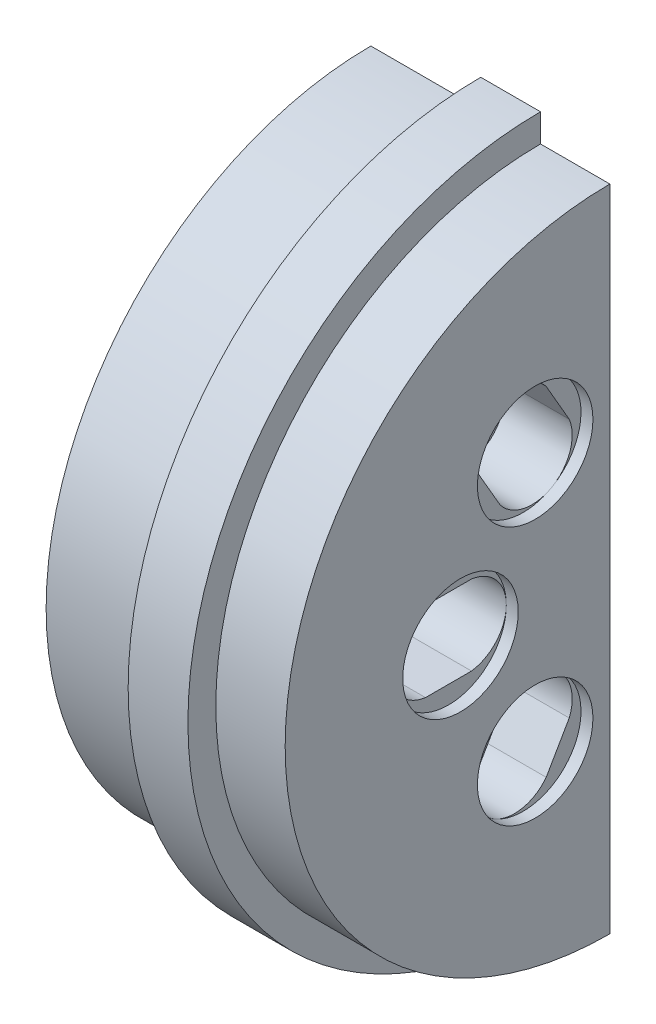
ISO-10303-21;
HEADER;
FILE_DESCRIPTION(('STEP AP214'),'2;1');
FILE_NAME('part.step','',(''),(''),'','','');
FILE_SCHEMA(('AUTOMOTIVE_DESIGN { 1 0 10303 214 1 1 1 1 }'));
ENDSEC;
DATA;
#1=APPLICATION_CONTEXT('core data for automotive mechanical design processes');
#2=APPLICATION_PROTOCOL_DEFINITION('international standard','automotive_design',2000,#1);
#3=PRODUCT_CONTEXT('',#1,'mechanical');
#4=PRODUCT('Part','Part','',(#3));
#5=PRODUCT_RELATED_PRODUCT_CATEGORY('part','',(#4));
#6=PRODUCT_DEFINITION_FORMATION('','',#4);
#7=PRODUCT_DEFINITION_CONTEXT('part definition',#1,'design');
#8=PRODUCT_DEFINITION('design','',#6,#7);
#9=PRODUCT_DEFINITION_SHAPE('','',#8);
#10=(LENGTH_UNIT() NAMED_UNIT(*) SI_UNIT(.MILLI.,.METRE.));
#11=(NAMED_UNIT(*) PLANE_ANGLE_UNIT() SI_UNIT($,.RADIAN.));
#12=(NAMED_UNIT(*) SI_UNIT($,.STERADIAN.) SOLID_ANGLE_UNIT());
#13=UNCERTAINTY_MEASURE_WITH_UNIT(LENGTH_MEASURE(1.E-05),#10,'distance_accuracy_value','');
#14=(GEOMETRIC_REPRESENTATION_CONTEXT(3) GLOBAL_UNCERTAINTY_ASSIGNED_CONTEXT((#13)) GLOBAL_UNIT_ASSIGNED_CONTEXT((#10,
#11,#12)) REPRESENTATION_CONTEXT('',''));
#15=CARTESIAN_POINT('',(0.,0.,0.));
#16=DIRECTION('',(0.,0.,1.));
#17=DIRECTION('',(1.,0.,0.));
#18=AXIS2_PLACEMENT_3D('',#15,#16,#17);
#19=CARTESIAN_POINT('',(10.,-2.93192297526447E-12,33.0929244030549));
#20=DIRECTION('',(1.,0.,0.));
#21=DIRECTION('',(0.,0.,-1.));
#22=AXIS2_PLACEMENT_3D('',#19,#20,#21);
#23=CYLINDRICAL_SURFACE('',#22,10.0929244030569);
#24=CARTESIAN_POINT('',(27.,-2.93192297526447E-12,33.0929244030549));
#25=DIRECTION('',(1.,0.,0.));
#26=DIRECTION('',(0.,0.,-1.));
#27=AXIS2_PLACEMENT_3D('',#24,#25,#26);
#28=CIRCLE('',#27,10.0929244030569);
#29=CARTESIAN_POINT('',(27.,-9.64650644313974E-12,23.));
#30=VERTEX_POINT('',#29);
#31=CARTESIAN_POINT('',(27.,-10.0000000000029,31.7264973081018));
#32=VERTEX_POINT('',#31);
#33=EDGE_CURVE('E251',#30,#32,#28,.F.);
#34=ORIENTED_EDGE('',*,*,#33,.F.);
#35=CARTESIAN_POINT('',(27.,9.99999999999707,31.7264973081017));
#36=VERTEX_POINT('',#35);
#37=EDGE_CURVE('E247',#36,#30,#28,.F.);
#38=ORIENTED_EDGE('',*,*,#37,.F.);
#39=DIRECTION('',(1.,0.,0.));
#40=VECTOR('',#39,1.);
#41=CARTESIAN_POINT('',(10.,9.99999999999707,31.7264973081017));
#42=LINE('',#41,#40);
#43=CARTESIAN_POINT('',(10.,9.99999999999707,31.7264973081017));
#44=VERTEX_POINT('',#43);
#45=EDGE_CURVE('E256',#44,#36,#42,.T.);
#46=ORIENTED_EDGE('',*,*,#45,.F.);
#47=CARTESIAN_POINT('',(10.,-2.93192297526447E-12,33.0929244030549));
#48=DIRECTION('',(1.,0.,0.));
#49=DIRECTION('',(0.,0.,1.));
#50=AXIS2_PLACEMENT_3D('',#47,#48,#49);
#51=CIRCLE('',#50,10.0929244030569);
#52=CARTESIAN_POINT('',(10.,-10.0000000000029,31.7264973081018));
#53=VERTEX_POINT('',#52);
#54=EDGE_CURVE('E283',#53,#44,#51,.T.);
#55=ORIENTED_EDGE('',*,*,#54,.F.);
#56=DIRECTION('',(1.,0.,0.));
#57=VECTOR('',#56,1.);
#58=CARTESIAN_POINT('',(10.,-10.0000000000029,31.7264973081018));
#59=LINE('',#58,#57);
#60=EDGE_CURVE('E255',#53,#32,#59,.T.);
#61=ORIENTED_EDGE('',*,*,#60,.T.);
#62=EDGE_LOOP('',(#34,#38,#46,#55,#61));
#63=FACE_BOUND('',#62,.T.);
#64=ADVANCED_FACE('F45',(#63),#23,.F.);
#65=CARTESIAN_POINT('',(10.,-10.0000000000029,43.2735026918943));
#66=DIRECTION('',(0.,-1.,0.));
#67=DIRECTION('',(0.,0.,-1.));
#68=AXIS2_PLACEMENT_3D('',#65,#66,#67);
#69=PLANE('',#68);
#70=DIRECTION('',(0.,0.,1.));
#71=VECTOR('',#70,1.);
#72=CARTESIAN_POINT('',(27.,-10.0000000000029,43.2735026918943));
#73=LINE('',#72,#71);
#74=CARTESIAN_POINT('',(27.,-10.0000000000029,43.2735026918943));
#75=VERTEX_POINT('',#74);
#76=EDGE_CURVE('E252',#32,#75,#73,.T.);
#77=ORIENTED_EDGE('',*,*,#76,.F.);
#78=ORIENTED_EDGE('',*,*,#60,.F.);
#79=DIRECTION('',(0.,0.,-1.));
#80=VECTOR('',#79,1.);
#81=CARTESIAN_POINT('',(10.,-10.0000000000029,43.2735026918943));
#82=LINE('',#81,#80);
#83=CARTESIAN_POINT('',(10.,-10.0000000000029,43.2735026918943));
#84=VERTEX_POINT('',#83);
#85=EDGE_CURVE('E260',#84,#53,#82,.T.);
#86=ORIENTED_EDGE('',*,*,#85,.F.);
#87=DIRECTION('',(1.,0.,0.));
#88=VECTOR('',#87,1.);
#89=CARTESIAN_POINT('',(10.,-10.0000000000029,43.2735026918943));
#90=LINE('',#89,#88);
#91=EDGE_CURVE('E265',#84,#75,#90,.T.);
#92=ORIENTED_EDGE('',*,*,#91,.T.);
#93=EDGE_LOOP('',(#77,#78,#86,#92));
#94=FACE_BOUND('',#93,.T.);
#95=ADVANCED_FACE('F503',(#94),#69,.F.);
#96=CARTESIAN_POINT('',(10.,-2.91348334438119E-12,41.907075596941));
#97=DIRECTION('',(1.,0.,0.));
#98=DIRECTION('',(0.,0.,-1.));
#99=AXIS2_PLACEMENT_3D('',#96,#97,#98);
#100=CYLINDRICAL_SURFACE('',#99,10.0929244030569);
#101=CARTESIAN_POINT('',(27.,-2.91348334438119E-12,41.907075596941));
#102=DIRECTION('',(1.,0.,0.));
#103=DIRECTION('',(0.,0.,-1.));
#104=AXIS2_PLACEMENT_3D('',#101,#102,#103);
#105=CIRCLE('',#104,10.0929244030569);
#106=CARTESIAN_POINT('',(27.,-9.58583703961193E-12,52.));
#107=VERTEX_POINT('',#106);
#108=CARTESIAN_POINT('',(27.,9.99999999999709,43.2735026918942));
#109=VERTEX_POINT('',#108);
#110=EDGE_CURVE('E60',#107,#109,#105,.F.);
#111=ORIENTED_EDGE('',*,*,#110,.F.);
#112=EDGE_CURVE('E248',#75,#107,#105,.F.);
#113=ORIENTED_EDGE('',*,*,#112,.F.);
#114=ORIENTED_EDGE('',*,*,#91,.F.);
#115=CARTESIAN_POINT('',(10.,-2.91348334438119E-12,41.907075596941));
#116=DIRECTION('',(1.,0.,0.));
#117=DIRECTION('',(0.,0.,1.));
#118=AXIS2_PLACEMENT_3D('',#115,#116,#117);
#119=CIRCLE('',#118,10.0929244030569);
#120=CARTESIAN_POINT('',(10.,9.99999999999709,43.2735026918942));
#121=VERTEX_POINT('',#120);
#122=EDGE_CURVE('E275',#121,#84,#119,.T.);
#123=ORIENTED_EDGE('',*,*,#122,.F.);
#124=DIRECTION('',(1.,0.,0.));
#125=VECTOR('',#124,1.);
#126=CARTESIAN_POINT('',(10.,9.99999999999709,43.2735026918942));
#127=LINE('',#126,#125);
#128=EDGE_CURVE('E261',#121,#109,#127,.T.);
#129=ORIENTED_EDGE('',*,*,#128,.T.);
#130=EDGE_LOOP('',(#111,#113,#114,#123,#129));
#131=FACE_BOUND('',#130,.T.);
#132=ADVANCED_FACE('F510',(#131),#100,.F.);
#133=CARTESIAN_POINT('',(10.,9.99999999999707,31.7264973081017));
#134=DIRECTION('',(0.,1.,0.));
#135=DIRECTION('',(0.,0.,1.));
#136=AXIS2_PLACEMENT_3D('',#133,#134,#135);
#137=PLANE('',#136);
#138=DIRECTION('',(0.,0.,-1.));
#139=VECTOR('',#138,1.);
#140=CARTESIAN_POINT('',(27.,9.99999999999707,31.7264973081017));
#141=LINE('',#140,#139);
#142=EDGE_CURVE('E11',#109,#36,#141,.T.);
#143=ORIENTED_EDGE('',*,*,#142,.F.);
#144=ORIENTED_EDGE('',*,*,#128,.F.);
#145=DIRECTION('',(0.,0.,1.));
#146=VECTOR('',#145,1.);
#147=CARTESIAN_POINT('',(10.,9.99999999999707,31.7264973081017));
#148=LINE('',#147,#146);
#149=EDGE_CURVE('E279',#44,#121,#148,.T.);
#150=ORIENTED_EDGE('',*,*,#149,.F.);
#151=ORIENTED_EDGE('',*,*,#45,.T.);
#152=EDGE_LOOP('',(#143,#144,#150,#151));
#153=FACE_BOUND('',#152,.T.);
#154=ADVANCED_FACE('F518',(#153),#137,.F.);
#155=CARTESIAN_POINT('',(10.,-28.659313218568,16.5464622015229));
#156=DIRECTION('',(1.,0.,0.));
#157=DIRECTION('',(0.,0.,-1.));
#158=AXIS2_PLACEMENT_3D('',#155,#156,#157);
#159=CYLINDRICAL_SURFACE('',#158,10.0929244030569);
#160=CARTESIAN_POINT('',(27.,-28.659313218568,16.5464622015229));
#161=DIRECTION('',(1.,0.,0.));
#162=DIRECTION('',(0.,0.,-1.));
#163=AXIS2_PLACEMENT_3D('',#160,#161,#162);
#164=CIRCLE('',#163,10.0929244030569);
#165=CARTESIAN_POINT('',(27.,-19.9185842870527,11.4999999999816));
#166=VERTEX_POINT('',#165);
#167=CARTESIAN_POINT('',(27.,-32.4759526419192,7.20299461620192));
#168=VERTEX_POINT('',#167);
#169=EDGE_CURVE('E241',#166,#168,#164,.F.);
#170=ORIENTED_EDGE('',*,*,#169,.F.);
#171=CARTESIAN_POINT('',(27.,-22.4759526419191,24.5235026918907));
#172=VERTEX_POINT('',#171);
#173=EDGE_CURVE('E237',#172,#166,#164,.F.);
#174=ORIENTED_EDGE('',*,*,#173,.F.);
#175=DIRECTION('',(1.,0.,0.));
#176=VECTOR('',#175,1.);
#177=CARTESIAN_POINT('',(10.,-22.4759526419191,24.5235026918907));
#178=LINE('',#177,#176);
#179=CARTESIAN_POINT('',(10.,-22.4759526419191,24.5235026918907));
#180=VERTEX_POINT('',#179);
#181=EDGE_CURVE('E319',#180,#172,#178,.T.);
#182=ORIENTED_EDGE('',*,*,#181,.F.);
#183=CARTESIAN_POINT('',(10.,-28.659313218568,16.5464622015229));
#184=DIRECTION('',(1.,0.,0.));
#185=DIRECTION('',(0.,0.,1.));
#186=AXIS2_PLACEMENT_3D('',#183,#184,#185);
#187=CIRCLE('',#186,10.0929244030569);
#188=CARTESIAN_POINT('',(10.,-32.4759526419192,7.20299461620193));
#189=VERTEX_POINT('',#188);
#190=EDGE_CURVE('E302',#189,#180,#187,.T.);
#191=ORIENTED_EDGE('',*,*,#190,.F.);
#192=DIRECTION('',(1.,0.,0.));
#193=VECTOR('',#192,1.);
#194=CARTESIAN_POINT('',(10.,-32.4759526419192,7.20299461620193));
#195=LINE('',#194,#193);
#196=EDGE_CURVE('E287',#189,#168,#195,.T.);
#197=ORIENTED_EDGE('',*,*,#196,.T.);
#198=EDGE_LOOP('',(#170,#174,#182,#191,#197));
#199=FACE_BOUND('',#198,.T.);
#200=ADVANCED_FACE('F449',(#199),#159,.F.);
#201=CARTESIAN_POINT('',(10.,-42.4759526419192,12.9764973080982));
#202=DIRECTION('',(0.,-0.500000000000002,-0.866025403784438));
#203=DIRECTION('',(0.,0.866025403784438,-0.500000000000002));
#204=AXIS2_PLACEMENT_3D('',#201,#202,#203);
#205=PLANE('',#204);
#206=DIRECTION('',(0.,-0.866025403784438,0.500000000000002));
#207=VECTOR('',#206,1.);
#208=CARTESIAN_POINT('',(27.,-42.4759526419192,12.9764973080982));
#209=LINE('',#208,#207);
#210=CARTESIAN_POINT('',(27.,-42.4759526419192,12.9764973080982));
#211=VERTEX_POINT('',#210);
#212=EDGE_CURVE('E242',#168,#211,#209,.T.);
#213=ORIENTED_EDGE('',*,*,#212,.F.);
#214=ORIENTED_EDGE('',*,*,#196,.F.);
#215=DIRECTION('',(0.,0.866025403784437,-0.500000000000002));
#216=VECTOR('',#215,1.);
#217=CARTESIAN_POINT('',(10.,-42.4759526419192,12.9764973080982));
#218=LINE('',#217,#216);
#219=CARTESIAN_POINT('',(10.,-42.4759526419192,12.9764973080982));
#220=VERTEX_POINT('',#219);
#221=EDGE_CURVE('E323',#220,#189,#218,.T.);
#222=ORIENTED_EDGE('',*,*,#221,.F.);
#223=DIRECTION('',(1.,0.,0.));
#224=VECTOR('',#223,1.);
#225=CARTESIAN_POINT('',(10.,-42.4759526419192,12.9764973080982));
#226=LINE('',#225,#224);
#227=EDGE_CURVE('E328',#220,#211,#226,.T.);
#228=ORIENTED_EDGE('',*,*,#227,.T.);
#229=EDGE_LOOP('',(#213,#214,#222,#228));
#230=FACE_BOUND('',#229,.T.);
#231=ADVANCED_FACE('F460',(#230),#205,.F.);
#232=CARTESIAN_POINT('',(10.,-36.2925920652703,20.953537798466));
#233=DIRECTION('',(1.,0.,0.));
#234=DIRECTION('',(0.,0.,-1.));
#235=AXIS2_PLACEMENT_3D('',#232,#233,#234);
#236=CYLINDRICAL_SURFACE('',#235,10.0929244030569);
#237=CARTESIAN_POINT('',(27.,-36.2925920652703,20.953537798466));
#238=DIRECTION('',(1.,0.,0.));
#239=DIRECTION('',(0.,0.,-1.));
#240=AXIS2_PLACEMENT_3D('',#237,#238,#239);
#241=CIRCLE('',#240,10.0929244030569);
#242=CARTESIAN_POINT('',(27.,-45.0333209968014,25.9999999999816));
#243=VERTEX_POINT('',#242);
#244=CARTESIAN_POINT('',(27.,-32.4759526419191,30.297005383787));
#245=VERTEX_POINT('',#244);
#246=EDGE_CURVE('E68',#243,#245,#241,.F.);
#247=ORIENTED_EDGE('',*,*,#246,.F.);
#248=EDGE_CURVE('E238',#211,#243,#241,.F.);
#249=ORIENTED_EDGE('',*,*,#248,.F.);
#250=ORIENTED_EDGE('',*,*,#227,.F.);
#251=CARTESIAN_POINT('',(10.,-36.2925920652703,20.953537798466));
#252=DIRECTION('',(1.,0.,0.));
#253=DIRECTION('',(0.,0.,1.));
#254=AXIS2_PLACEMENT_3D('',#251,#252,#253);
#255=CIRCLE('',#254,10.0929244030569);
#256=CARTESIAN_POINT('',(10.,-32.4759526419191,30.297005383787));
#257=VERTEX_POINT('',#256);
#258=EDGE_CURVE('E338',#257,#220,#255,.T.);
#259=ORIENTED_EDGE('',*,*,#258,.F.);
#260=DIRECTION('',(1.,0.,0.));
#261=VECTOR('',#260,1.);
#262=CARTESIAN_POINT('',(10.,-32.4759526419191,30.297005383787));
#263=LINE('',#262,#261);
#264=EDGE_CURVE('E324',#257,#245,#263,.T.);
#265=ORIENTED_EDGE('',*,*,#264,.T.);
#266=EDGE_LOOP('',(#247,#249,#250,#259,#265));
#267=FACE_BOUND('',#266,.T.);
#268=ADVANCED_FACE('F466',(#267),#236,.F.);
#269=CARTESIAN_POINT('',(10.,-22.4759526419191,24.5235026918907));
#270=DIRECTION('',(0.,0.500000000000002,0.866025403784438));
#271=DIRECTION('',(0.,-0.866025403784438,0.500000000000002));
#272=AXIS2_PLACEMENT_3D('',#269,#270,#271);
#273=PLANE('',#272);
#274=DIRECTION('',(0.,0.866025403784438,-0.500000000000002));
#275=VECTOR('',#274,1.);
#276=CARTESIAN_POINT('',(27.,-22.4759526419191,24.5235026918907));
#277=LINE('',#276,#275);
#278=EDGE_CURVE('E54',#245,#172,#277,.T.);
#279=ORIENTED_EDGE('',*,*,#278,.F.);
#280=ORIENTED_EDGE('',*,*,#264,.F.);
#281=DIRECTION('',(0.,-0.866025403784438,0.500000000000002));
#282=VECTOR('',#281,1.);
#283=CARTESIAN_POINT('',(10.,-22.4759526419191,24.5235026918907));
#284=LINE('',#283,#282);
#285=EDGE_CURVE('E342',#180,#257,#284,.T.);
#286=ORIENTED_EDGE('',*,*,#285,.F.);
#287=ORIENTED_EDGE('',*,*,#181,.T.);
#288=EDGE_LOOP('',(#279,#280,#286,#287));
#289=FACE_BOUND('',#288,.T.);
#290=ADVANCED_FACE('F452',(#289),#273,.F.);
#291=CARTESIAN_POINT('',(10.,28.6593132185654,16.5464622015284));
#292=DIRECTION('',(1.,0.,0.));
#293=DIRECTION('',(0.,0.,-1.));
#294=AXIS2_PLACEMENT_3D('',#291,#292,#293);
#295=CYLINDRICAL_SURFACE('',#294,10.0929244030569);
#296=CARTESIAN_POINT('',(27.,28.6593132185654,16.5464622015284));
#297=DIRECTION('',(1.,0.,0.));
#298=DIRECTION('',(0.,0.,-1.));
#299=AXIS2_PLACEMENT_3D('',#296,#297,#298);
#300=CIRCLE('',#299,10.0929244030569);
#301=CARTESIAN_POINT('',(27.,19.9185842870421,11.4999999999999));
#302=VERTEX_POINT('',#301);
#303=CARTESIAN_POINT('',(27.,22.4759526419165,24.5235026918962));
#304=VERTEX_POINT('',#303);
#305=EDGE_CURVE('E202',#302,#304,#300,.F.);
#306=ORIENTED_EDGE('',*,*,#305,.F.);
#307=CARTESIAN_POINT('',(27.,32.4759526419165,7.20299461620741));
#308=VERTEX_POINT('',#307);
#309=EDGE_CURVE('E211',#308,#302,#300,.F.);
#310=ORIENTED_EDGE('',*,*,#309,.F.);
#311=DIRECTION('',(1.,0.,0.));
#312=VECTOR('',#311,1.);
#313=CARTESIAN_POINT('',(10.,32.4759526419165,7.20299461620741));
#314=LINE('',#313,#312);
#315=CARTESIAN_POINT('',(10.,32.4759526419165,7.20299461620741));
#316=VERTEX_POINT('',#315);
#317=EDGE_CURVE('E288',#316,#308,#314,.T.);
#318=ORIENTED_EDGE('',*,*,#317,.F.);
#319=CARTESIAN_POINT('',(10.,28.6593132185654,16.5464622015284));
#320=DIRECTION('',(1.,0.,0.));
#321=DIRECTION('',(0.,0.,1.));
#322=AXIS2_PLACEMENT_3D('',#319,#320,#321);
#323=CIRCLE('',#322,10.0929244030569);
#324=CARTESIAN_POINT('',(10.,22.4759526419165,24.5235026918962));
#325=VERTEX_POINT('',#324);
#326=EDGE_CURVE('E314',#325,#316,#323,.T.);
#327=ORIENTED_EDGE('',*,*,#326,.F.);
#328=DIRECTION('',(1.,0.,0.));
#329=VECTOR('',#328,1.);
#330=CARTESIAN_POINT('',(10.,22.4759526419165,24.5235026918962));
#331=LINE('',#330,#329);
#332=EDGE_CURVE('E298',#325,#304,#331,.T.);
#333=ORIENTED_EDGE('',*,*,#332,.T.);
#334=EDGE_LOOP('',(#306,#310,#318,#327,#333));
#335=FACE_BOUND('',#334,.T.);
#336=ADVANCED_FACE('F483',(#335),#295,.F.);
#337=CARTESIAN_POINT('',(10.,32.4759526419165,30.2970053837924));
#338=DIRECTION('',(0.,-0.499999999999999,0.866025403784439));
#339=DIRECTION('',(0.,-0.866025403784439,-0.499999999999999));
#340=AXIS2_PLACEMENT_3D('',#337,#338,#339);
#341=PLANE('',#340);
#342=DIRECTION('',(0.,0.866025403784439,0.499999999999999));
#343=VECTOR('',#342,1.);
#344=CARTESIAN_POINT('',(27.,32.4759526419165,30.2970053837924));
#345=LINE('',#344,#343);
#346=CARTESIAN_POINT('',(27.,32.4759526419165,30.2970053837924));
#347=VERTEX_POINT('',#346);
#348=EDGE_CURVE('E197',#304,#347,#345,.T.);
#349=ORIENTED_EDGE('',*,*,#348,.F.);
#350=ORIENTED_EDGE('',*,*,#332,.F.);
#351=DIRECTION('',(0.,-0.866025403784439,-0.499999999999999));
#352=VECTOR('',#351,1.);
#353=CARTESIAN_POINT('',(10.,32.4759526419165,30.2970053837924));
#354=LINE('',#353,#352);
#355=CARTESIAN_POINT('',(10.,32.4759526419165,30.2970053837924));
#356=VERTEX_POINT('',#355);
#357=EDGE_CURVE('E292',#356,#325,#354,.T.);
#358=ORIENTED_EDGE('',*,*,#357,.F.);
#359=DIRECTION('',(1.,0.,0.));
#360=VECTOR('',#359,1.);
#361=CARTESIAN_POINT('',(10.,32.4759526419165,30.2970053837924));
#362=LINE('',#361,#360);
#363=EDGE_CURVE('E295',#356,#347,#362,.T.);
#364=ORIENTED_EDGE('',*,*,#363,.T.);
#365=EDGE_LOOP('',(#349,#350,#358,#364));
#366=FACE_BOUND('',#365,.T.);
#367=ADVANCED_FACE('F480',(#366),#341,.F.);
#368=CARTESIAN_POINT('',(10.,36.2925920652677,20.9535377984715));
#369=DIRECTION('',(1.,0.,0.));
#370=DIRECTION('',(0.,0.,-1.));
#371=AXIS2_PLACEMENT_3D('',#368,#369,#370);
#372=CYLINDRICAL_SURFACE('',#371,10.0929244030569);
#373=CARTESIAN_POINT('',(27.,36.2925920652677,20.9535377984715));
#374=DIRECTION('',(1.,0.,0.));
#375=DIRECTION('',(0.,0.,-1.));
#376=AXIS2_PLACEMENT_3D('',#373,#374,#375);
#377=CIRCLE('',#376,10.0929244030569);
#378=CARTESIAN_POINT('',(27.,45.0333209967909,25.9999999999999));
#379=VERTEX_POINT('',#378);
#380=CARTESIAN_POINT('',(27.,42.4759526419165,12.9764973081037));
#381=VERTEX_POINT('',#380);
#382=EDGE_CURVE('E204',#379,#381,#377,.F.);
#383=ORIENTED_EDGE('',*,*,#382,.F.);
#384=EDGE_CURVE('E190',#347,#379,#377,.F.);
#385=ORIENTED_EDGE('',*,*,#384,.F.);
#386=ORIENTED_EDGE('',*,*,#363,.F.);
#387=CARTESIAN_POINT('',(10.,36.2925920652677,20.9535377984715));
#388=DIRECTION('',(1.,0.,0.));
#389=DIRECTION('',(0.,0.,1.));
#390=AXIS2_PLACEMENT_3D('',#387,#388,#389);
#391=CIRCLE('',#390,10.0929244030569);
#392=CARTESIAN_POINT('',(10.,42.4759526419165,12.9764973081037));
#393=VERTEX_POINT('',#392);
#394=EDGE_CURVE('E306',#393,#356,#391,.T.);
#395=ORIENTED_EDGE('',*,*,#394,.F.);
#396=DIRECTION('',(1.,0.,0.));
#397=VECTOR('',#396,1.);
#398=CARTESIAN_POINT('',(10.,42.4759526419165,12.9764973081037));
#399=LINE('',#398,#397);
#400=EDGE_CURVE('E221',#393,#381,#399,.T.);
#401=ORIENTED_EDGE('',*,*,#400,.T.);
#402=EDGE_LOOP('',(#383,#385,#386,#395,#401));
#403=FACE_BOUND('',#402,.T.);
#404=ADVANCED_FACE('F219',(#403),#372,.F.);
#405=CARTESIAN_POINT('',(10.,32.4759526419165,7.20299461620741));
#406=DIRECTION('',(0.,0.499999999999999,-0.866025403784439));
#407=DIRECTION('',(0.,0.866025403784439,0.499999999999999));
#408=AXIS2_PLACEMENT_3D('',#405,#406,#407);
#409=PLANE('',#408);
#410=DIRECTION('',(0.,-0.866025403784439,-0.499999999999999));
#411=VECTOR('',#410,1.);
#412=CARTESIAN_POINT('',(27.,32.4759526419165,7.20299461620741));
#413=LINE('',#412,#411);
#414=EDGE_CURVE('E429',#381,#308,#413,.T.);
#415=ORIENTED_EDGE('',*,*,#414,.F.);
#416=ORIENTED_EDGE('',*,*,#400,.F.);
#417=DIRECTION('',(0.,0.866025403784439,0.499999999999999));
#418=VECTOR('',#417,1.);
#419=CARTESIAN_POINT('',(10.,32.4759526419165,7.20299461620741));
#420=LINE('',#419,#418);
#421=EDGE_CURVE('E310',#316,#393,#420,.T.);
#422=ORIENTED_EDGE('',*,*,#421,.F.);
#423=ORIENTED_EDGE('',*,*,#317,.T.);
#424=EDGE_LOOP('',(#415,#416,#422,#423));
#425=FACE_BOUND('',#424,.T.);
#426=ADVANCED_FACE('F489',(#425),#409,.F.);
#427=CARTESIAN_POINT('',(0.,0.,0.));
#428=DIRECTION('',(1.,0.,0.));
#429=DIRECTION('',(0.,0.,-1.));
#430=AXIS2_PLACEMENT_3D('',#427,#428,#429);
#431=CYLINDRICAL_SURFACE('',#430,81.5);
#432=CARTESIAN_POINT('',(30.,0.,0.));
#433=DIRECTION('',(1.,0.,0.));
#434=DIRECTION('',(0.,0.,-1.));
#435=AXIS2_PLACEMENT_3D('',#432,#433,#434);
#436=CIRCLE('',#435,81.5);
#437=CARTESIAN_POINT('',(30.,81.5,-5.69111458231431E-13));
#438=VERTEX_POINT('',#437);
#439=CARTESIAN_POINT('',(30.,-81.5,0.));
#440=VERTEX_POINT('',#439);
#441=EDGE_CURVE('E425',#438,#440,#436,.T.);
#442=ORIENTED_EDGE('',*,*,#441,.F.);
#443=DIRECTION('',(1.,0.,0.));
#444=VECTOR('',#443,1.);
#445=CARTESIAN_POINT('',(12.5885,81.5,-5.69111458231431E-13));
#446=LINE('',#445,#444);
#447=CARTESIAN_POINT('',(12.5885,81.5,-5.69111458231431E-13));
#448=VERTEX_POINT('',#447);
#449=EDGE_CURVE('E382',#448,#438,#446,.T.);
#450=ORIENTED_EDGE('',*,*,#449,.F.);
#451=CARTESIAN_POINT('',(12.5885,0.,0.));
#452=DIRECTION('',(1.,0.,0.));
#453=DIRECTION('',(0.,0.,-1.));
#454=AXIS2_PLACEMENT_3D('',#451,#452,#453);
#455=CIRCLE('',#454,81.5);
#456=CARTESIAN_POINT('',(12.5885,-81.5,0.));
#457=VERTEX_POINT('',#456);
#458=EDGE_CURVE('E409',#448,#457,#455,.T.);
#459=ORIENTED_EDGE('',*,*,#458,.T.);
#460=DIRECTION('',(1.,0.,0.));
#461=VECTOR('',#460,1.);
#462=CARTESIAN_POINT('',(12.5885,-81.5,0.));
#463=LINE('',#462,#461);
#464=EDGE_CURVE('E353',#457,#440,#463,.T.);
#465=ORIENTED_EDGE('',*,*,#464,.T.);
#466=EDGE_LOOP('',(#442,#450,#459,#465));
#467=FACE_BOUND('',#466,.T.);
#468=ADVANCED_FACE('F491',(#467),#431,.T.);
#469=CARTESIAN_POINT('',(30.,81.5,-5.69111458231431E-13));
#470=DIRECTION('',(-1.,0.,0.));
#471=DIRECTION('',(0.,0.,1.));
#472=AXIS2_PLACEMENT_3D('',#469,#470,#471);
#473=PLANE('',#472);
#474=CARTESIAN_POINT('',(30.,32.4759526419165,18.7499999999999));
#475=DIRECTION('',(1.,0.,0.));
#476=DIRECTION('',(0.,0.,-1.));
#477=AXIS2_PLACEMENT_3D('',#474,#475,#476);
#478=CIRCLE('',#477,14.5);
#479=CARTESIAN_POINT('',(30.,32.4759526419165,4.24999999999993));
#480=VERTEX_POINT('',#479);
#481=EDGE_CURVE('E217',#480,#480,#478,.T.);
#482=ORIENTED_EDGE('',*,*,#481,.F.);
#483=EDGE_LOOP('',(#482));
#484=FACE_BOUND('',#483,.T.);
#485=CARTESIAN_POINT('',(30.,-32.4759526419162,18.7500000000004));
#486=DIRECTION('',(1.,0.,0.));
#487=DIRECTION('',(0.,0.,-1.));
#488=AXIS2_PLACEMENT_3D('',#485,#486,#487);
#489=CIRCLE('',#488,14.5);
#490=CARTESIAN_POINT('',(30.,-32.4759526419162,4.25000000000038));
#491=VERTEX_POINT('',#490);
#492=EDGE_CURVE('E613',#491,#491,#489,.T.);
#493=ORIENTED_EDGE('',*,*,#492,.F.);
#494=EDGE_LOOP('',(#493));
#495=FACE_BOUND('',#494,.T.);
#496=CARTESIAN_POINT('',(30.,0.,37.5));
#497=DIRECTION('',(1.,0.,0.));
#498=DIRECTION('',(0.,0.,-1.));
#499=AXIS2_PLACEMENT_3D('',#496,#497,#498);
#500=CIRCLE('',#499,14.5);
#501=CARTESIAN_POINT('',(30.,0.,23.));
#502=VERTEX_POINT('',#501);
#503=EDGE_CURVE('E231',#502,#502,#500,.T.);
#504=ORIENTED_EDGE('',*,*,#503,.F.);
#505=EDGE_LOOP('',(#504));
#506=FACE_BOUND('',#505,.T.);
#507=ORIENTED_EDGE('',*,*,#441,.T.);
#508=DIRECTION('',(0.,-1.,0.));
#509=VECTOR('',#508,1.);
#510=CARTESIAN_POINT('',(30.,81.5,-5.69111458231431E-13));
#511=LINE('',#510,#509);
#512=EDGE_CURVE('E386',#438,#440,#511,.T.);
#513=ORIENTED_EDGE('',*,*,#512,.F.);
#514=EDGE_LOOP('',(#507,#513));
#515=FACE_BOUND('',#514,.T.);
#516=ADVANCED_FACE('F47',(#484,#495,#506,#515),#473,.F.);
#517=CARTESIAN_POINT('',(-30.,81.5,-5.69111458231431E-13));
#518=DIRECTION('',(1.,0.,0.));
#519=DIRECTION('',(0.,0.,-1.));
#520=AXIS2_PLACEMENT_3D('',#517,#518,#519);
#521=PLANE('',#520);
#522=CARTESIAN_POINT('',(-30.,0.,37.5));
#523=DIRECTION('',(1.,0.,0.));
#524=DIRECTION('',(0.,0.,-1.));
#525=AXIS2_PLACEMENT_3D('',#522,#523,#524);
#526=CIRCLE('',#525,6.6);
#527=CARTESIAN_POINT('',(-30.,0.,30.9));
#528=VERTEX_POINT('',#527);
#529=EDGE_CURVE('E349',#528,#528,#526,.T.);
#530=ORIENTED_EDGE('',*,*,#529,.T.);
#531=EDGE_LOOP('',(#530));
#532=FACE_BOUND('',#531,.T.);
#533=CARTESIAN_POINT('',(-30.,-32.4759526419162,18.7500000000004));
#534=DIRECTION('',(1.,0.,0.));
#535=DIRECTION('',(0.,0.,-1.));
#536=AXIS2_PLACEMENT_3D('',#533,#534,#535);
#537=CIRCLE('',#536,6.6);
#538=CARTESIAN_POINT('',(-30.,-32.4759526419162,12.1500000000004));
#539=VERTEX_POINT('',#538);
#540=EDGE_CURVE('E355',#539,#539,#537,.T.);
#541=ORIENTED_EDGE('',*,*,#540,.T.);
#542=EDGE_LOOP('',(#541));
#543=FACE_BOUND('',#542,.T.);
#544=CARTESIAN_POINT('',(-30.,32.4759526419165,18.7499999999999));
#545=DIRECTION('',(1.,0.,0.));
#546=DIRECTION('',(0.,0.,-1.));
#547=AXIS2_PLACEMENT_3D('',#544,#545,#546);
#548=CIRCLE('',#547,6.6);
#549=CARTESIAN_POINT('',(-30.,32.4759526419165,12.1499999999999));
#550=VERTEX_POINT('',#549);
#551=EDGE_CURVE('E354',#550,#550,#548,.T.);
#552=ORIENTED_EDGE('',*,*,#551,.T.);
#553=EDGE_LOOP('',(#552));
#554=FACE_BOUND('',#553,.T.);
#555=CARTESIAN_POINT('',(-30.,0.,0.));
#556=DIRECTION('',(1.,0.,0.));
#557=DIRECTION('',(0.,0.,-1.));
#558=AXIS2_PLACEMENT_3D('',#555,#556,#557);
#559=CIRCLE('',#558,81.5);
#560=CARTESIAN_POINT('',(-30.,81.5,-5.69111458231431E-13));
#561=VERTEX_POINT('',#560);
#562=CARTESIAN_POINT('',(-30.,-81.5,0.));
#563=VERTEX_POINT('',#562);
#564=EDGE_CURVE('E421',#561,#563,#559,.T.);
#565=ORIENTED_EDGE('',*,*,#564,.F.);
#566=DIRECTION('',(0.,1.,0.));
#567=VECTOR('',#566,1.);
#568=CARTESIAN_POINT('',(-30.,81.5,-5.69111458231431E-13));
#569=LINE('',#568,#567);
#570=EDGE_CURVE('E389',#563,#561,#569,.T.);
#571=ORIENTED_EDGE('',*,*,#570,.F.);
#572=EDGE_LOOP('',(#565,#571));
#573=FACE_BOUND('',#572,.T.);
#574=ADVANCED_FACE('F576',(#532,#543,#554,#573),#521,.F.);
#575=CARTESIAN_POINT('',(0.,0.,0.));
#576=DIRECTION('',(1.,0.,0.));
#577=DIRECTION('',(0.,0.,-1.));
#578=AXIS2_PLACEMENT_3D('',#575,#576,#577);
#579=CYLINDRICAL_SURFACE('',#578,81.5);
#580=CARTESIAN_POINT('',(-2.4115,0.,0.));
#581=DIRECTION('',(1.,0.,0.));
#582=DIRECTION('',(0.,0.,-1.));
#583=AXIS2_PLACEMENT_3D('',#580,#581,#582);
#584=CIRCLE('',#583,81.5);
#585=CARTESIAN_POINT('',(-2.4115,81.5,-5.69111458231431E-13));
#586=VERTEX_POINT('',#585);
#587=CARTESIAN_POINT('',(-2.4115,-81.5,0.));
#588=VERTEX_POINT('',#587);
#589=EDGE_CURVE('E418',#586,#588,#584,.T.);
#590=ORIENTED_EDGE('',*,*,#589,.F.);
#591=DIRECTION('',(1.,0.,0.));
#592=VECTOR('',#591,1.);
#593=CARTESIAN_POINT('',(-2.4115,81.5,-5.69111458231431E-13));
#594=LINE('',#593,#592);
#595=EDGE_CURVE('E393',#561,#586,#594,.T.);
#596=ORIENTED_EDGE('',*,*,#595,.F.);
#597=ORIENTED_EDGE('',*,*,#564,.T.);
#598=DIRECTION('',(1.,0.,0.));
#599=VECTOR('',#598,1.);
#600=CARTESIAN_POINT('',(-2.4115,-81.5,0.));
#601=LINE('',#600,#599);
#602=EDGE_CURVE('E366',#563,#588,#601,.T.);
#603=ORIENTED_EDGE('',*,*,#602,.T.);
#604=EDGE_LOOP('',(#590,#596,#597,#603));
#605=FACE_BOUND('',#604,.T.);
#606=ADVANCED_FACE('F573',(#605),#579,.T.);
#607=CARTESIAN_POINT('',(-2.4115,88.5,-6.17992196975235E-13));
#608=DIRECTION('',(1.,0.,0.));
#609=DIRECTION('',(0.,0.,-1.));
#610=AXIS2_PLACEMENT_3D('',#607,#608,#609);
#611=PLANE('',#610);
#612=CARTESIAN_POINT('',(-2.4115,0.,0.));
#613=DIRECTION('',(1.,0.,0.));
#614=DIRECTION('',(0.,0.,-1.));
#615=AXIS2_PLACEMENT_3D('',#612,#613,#614);
#616=CIRCLE('',#615,88.5);
#617=CARTESIAN_POINT('',(-2.4115,88.5,-6.17992196975235E-13));
#618=VERTEX_POINT('',#617);
#619=CARTESIAN_POINT('',(-2.4115,-88.5,0.));
#620=VERTEX_POINT('',#619);
#621=EDGE_CURVE('E415',#618,#620,#616,.T.);
#622=ORIENTED_EDGE('',*,*,#621,.F.);
#623=DIRECTION('',(0.,1.,0.));
#624=VECTOR('',#623,1.);
#625=CARTESIAN_POINT('',(-2.4115,88.5,-6.17992196975235E-13));
#626=LINE('',#625,#624);
#627=EDGE_CURVE('E397',#586,#618,#626,.T.);
#628=ORIENTED_EDGE('',*,*,#627,.F.);
#629=ORIENTED_EDGE('',*,*,#589,.T.);
#630=DIRECTION('',(0.,-1.,0.));
#631=VECTOR('',#630,1.);
#632=CARTESIAN_POINT('',(-2.4115,-88.5,0.));
#633=LINE('',#632,#631);
#634=EDGE_CURVE('E370',#588,#620,#633,.T.);
#635=ORIENTED_EDGE('',*,*,#634,.T.);
#636=EDGE_LOOP('',(#622,#628,#629,#635));
#637=FACE_BOUND('',#636,.T.);
#638=ADVANCED_FACE('F569',(#637),#611,.F.);
#639=CARTESIAN_POINT('',(0.,0.,0.));
#640=DIRECTION('',(1.,0.,0.));
#641=DIRECTION('',(0.,0.,-1.));
#642=AXIS2_PLACEMENT_3D('',#639,#640,#641);
#643=CYLINDRICAL_SURFACE('',#642,88.5);
#644=CARTESIAN_POINT('',(12.5885,0.,0.));
#645=DIRECTION('',(1.,0.,0.));
#646=DIRECTION('',(0.,0.,-1.));
#647=AXIS2_PLACEMENT_3D('',#644,#645,#646);
#648=CIRCLE('',#647,88.5);
#649=CARTESIAN_POINT('',(12.5885,88.5,-6.17992196975235E-13));
#650=VERTEX_POINT('',#649);
#651=CARTESIAN_POINT('',(12.5885,-88.5,0.));
#652=VERTEX_POINT('',#651);
#653=EDGE_CURVE('E412',#650,#652,#648,.T.);
#654=ORIENTED_EDGE('',*,*,#653,.F.);
#655=DIRECTION('',(1.,0.,0.));
#656=VECTOR('',#655,1.);
#657=CARTESIAN_POINT('',(12.5885,88.5,-6.17992196975235E-13));
#658=LINE('',#657,#656);
#659=EDGE_CURVE('E401',#618,#650,#658,.T.);
#660=ORIENTED_EDGE('',*,*,#659,.F.);
#661=ORIENTED_EDGE('',*,*,#621,.T.);
#662=DIRECTION('',(1.,0.,0.));
#663=VECTOR('',#662,1.);
#664=CARTESIAN_POINT('',(12.5885,-88.5,0.));
#665=LINE('',#664,#663);
#666=EDGE_CURVE('E374',#620,#652,#665,.T.);
#667=ORIENTED_EDGE('',*,*,#666,.T.);
#668=EDGE_LOOP('',(#654,#660,#661,#667));
#669=FACE_BOUND('',#668,.T.);
#670=ADVANCED_FACE('F565',(#669),#643,.T.);
#671=CARTESIAN_POINT('',(12.5885,88.5,-6.17992196975235E-13));
#672=DIRECTION('',(-1.,0.,0.));
#673=DIRECTION('',(0.,0.,1.));
#674=AXIS2_PLACEMENT_3D('',#671,#672,#673);
#675=PLANE('',#674);
#676=DIRECTION('',(0.,-1.,0.));
#677=VECTOR('',#676,1.);
#678=CARTESIAN_POINT('',(12.5885,88.5,-6.17992196975235E-13));
#679=LINE('',#678,#677);
#680=EDGE_CURVE('E405',#650,#448,#679,.T.);
#681=ORIENTED_EDGE('',*,*,#680,.F.);
#682=ORIENTED_EDGE('',*,*,#653,.T.);
#683=DIRECTION('',(0.,1.,0.));
#684=VECTOR('',#683,1.);
#685=CARTESIAN_POINT('',(12.5885,-88.5,0.));
#686=LINE('',#685,#684);
#687=EDGE_CURVE('E378',#652,#457,#686,.T.);
#688=ORIENTED_EDGE('',*,*,#687,.T.);
#689=ORIENTED_EDGE('',*,*,#458,.F.);
#690=EDGE_LOOP('',(#681,#682,#688,#689));
#691=FACE_BOUND('',#690,.T.);
#692=ADVANCED_FACE('F560',(#691),#675,.F.);
#693=CARTESIAN_POINT('',(0.,0.,0.));
#694=DIRECTION('',(0.,0.,-1.));
#695=DIRECTION('',(1.,0.,0.));
#696=AXIS2_PLACEMENT_3D('',#693,#694,#695);
#697=PLANE('',#696);
#698=ORIENTED_EDGE('',*,*,#449,.T.);
#699=ORIENTED_EDGE('',*,*,#512,.T.);
#700=ORIENTED_EDGE('',*,*,#464,.F.);
#701=ORIENTED_EDGE('',*,*,#687,.F.);
#702=ORIENTED_EDGE('',*,*,#666,.F.);
#703=ORIENTED_EDGE('',*,*,#634,.F.);
#704=ORIENTED_EDGE('',*,*,#602,.F.);
#705=ORIENTED_EDGE('',*,*,#570,.T.);
#706=ORIENTED_EDGE('',*,*,#595,.T.);
#707=ORIENTED_EDGE('',*,*,#627,.T.);
#708=ORIENTED_EDGE('',*,*,#659,.T.);
#709=ORIENTED_EDGE('',*,*,#680,.T.);
#710=EDGE_LOOP('',(#698,#699,#700,#701,#702,#703,#704,#705,#706,#707,#708,#709));
#711=FACE_BOUND('',#710,.T.);
#712=ADVANCED_FACE('F557',(#711),#697,.T.);
#713=CARTESIAN_POINT('',(-30.,32.4759526419165,18.7499999999999));
#714=DIRECTION('',(1.,0.,0.));
#715=DIRECTION('',(0.,0.,-1.));
#716=AXIS2_PLACEMENT_3D('',#713,#714,#715);
#717=CYLINDRICAL_SURFACE('',#716,6.6);
#718=CARTESIAN_POINT('',(9.99999999999999,32.4759526419165,18.7499999999999));
#719=DIRECTION('',(-1.,0.,0.));
#720=DIRECTION('',(0.,0.,1.));
#721=AXIS2_PLACEMENT_3D('',#718,#719,#720);
#722=CIRCLE('',#721,6.6);
#723=CARTESIAN_POINT('',(9.99999999999999,32.4759526419165,25.3499999999999));
#724=VERTEX_POINT('',#723);
#725=EDGE_CURVE('E359',#724,#724,#722,.F.);
#726=ORIENTED_EDGE('',*,*,#725,.T.);
#727=EDGE_LOOP('',(#726));
#728=FACE_BOUND('',#727,.T.);
#729=ORIENTED_EDGE('',*,*,#551,.F.);
#730=EDGE_LOOP('',(#729));
#731=FACE_BOUND('',#730,.T.);
#732=ADVANCED_FACE('F553',(#728,#731),#717,.F.);
#733=CARTESIAN_POINT('',(-30.,-32.4759526419162,18.7500000000004));
#734=DIRECTION('',(1.,0.,0.));
#735=DIRECTION('',(0.,0.,-1.));
#736=AXIS2_PLACEMENT_3D('',#733,#734,#735);
#737=CYLINDRICAL_SURFACE('',#736,6.6);
#738=CARTESIAN_POINT('',(9.99999999999999,-32.4759526419162,18.7500000000004));
#739=DIRECTION('',(-1.,0.,0.));
#740=DIRECTION('',(0.,0.,1.));
#741=AXIS2_PLACEMENT_3D('',#738,#739,#740);
#742=CIRCLE('',#741,6.6);
#743=CARTESIAN_POINT('',(9.99999999999999,-32.4759526419162,25.3500000000004));
#744=VERTEX_POINT('',#743);
#745=EDGE_CURVE('E433',#744,#744,#742,.F.);
#746=ORIENTED_EDGE('',*,*,#745,.T.);
#747=EDGE_LOOP('',(#746));
#748=FACE_BOUND('',#747,.T.);
#749=ORIENTED_EDGE('',*,*,#540,.F.);
#750=EDGE_LOOP('',(#749));
#751=FACE_BOUND('',#750,.T.);
#752=ADVANCED_FACE('F549',(#748,#751),#737,.F.);
#753=CARTESIAN_POINT('',(-30.,0.,37.5));
#754=DIRECTION('',(1.,0.,0.));
#755=DIRECTION('',(0.,0.,-1.));
#756=AXIS2_PLACEMENT_3D('',#753,#754,#755);
#757=CYLINDRICAL_SURFACE('',#756,6.6);
#758=CARTESIAN_POINT('',(9.99999999999999,0.,37.5));
#759=DIRECTION('',(-1.,0.,0.));
#760=DIRECTION('',(0.,0.,1.));
#761=AXIS2_PLACEMENT_3D('',#758,#759,#760);
#762=CIRCLE('',#761,6.6);
#763=CARTESIAN_POINT('',(9.99999999999999,0.,44.1));
#764=VERTEX_POINT('',#763);
#765=EDGE_CURVE('E318',#764,#764,#762,.F.);
#766=ORIENTED_EDGE('',*,*,#765,.T.);
#767=EDGE_LOOP('',(#766));
#768=FACE_BOUND('',#767,.T.);
#769=ORIENTED_EDGE('',*,*,#529,.F.);
#770=EDGE_LOOP('',(#769));
#771=FACE_BOUND('',#770,.T.);
#772=ADVANCED_FACE('F527',(#768,#771),#757,.F.);
#773=CARTESIAN_POINT('',(10.,-2.93192297526447E-12,33.0929244030549));
#774=DIRECTION('',(-1.,0.,0.));
#775=DIRECTION('',(0.,0.,1.));
#776=AXIS2_PLACEMENT_3D('',#773,#774,#775);
#777=PLANE('',#776);
#778=ORIENTED_EDGE('',*,*,#54,.T.);
#779=ORIENTED_EDGE('',*,*,#149,.T.);
#780=ORIENTED_EDGE('',*,*,#122,.T.);
#781=ORIENTED_EDGE('',*,*,#85,.T.);
#782=EDGE_LOOP('',(#778,#779,#780,#781));
#783=FACE_BOUND('',#782,.T.);
#784=ORIENTED_EDGE('',*,*,#765,.F.);
#785=EDGE_LOOP('',(#784));
#786=FACE_BOUND('',#785,.T.);
#787=ADVANCED_FACE('F525',(#783,#786),#777,.F.);
#788=CARTESIAN_POINT('',(10.,-28.659313218568,16.5464622015229));
#789=DIRECTION('',(-1.,0.,0.));
#790=DIRECTION('',(0.,0.,1.));
#791=AXIS2_PLACEMENT_3D('',#788,#789,#790);
#792=PLANE('',#791);
#793=ORIENTED_EDGE('',*,*,#190,.T.);
#794=ORIENTED_EDGE('',*,*,#285,.T.);
#795=ORIENTED_EDGE('',*,*,#258,.T.);
#796=ORIENTED_EDGE('',*,*,#221,.T.);
#797=EDGE_LOOP('',(#793,#794,#795,#796));
#798=FACE_BOUND('',#797,.T.);
#799=ORIENTED_EDGE('',*,*,#745,.F.);
#800=EDGE_LOOP('',(#799));
#801=FACE_BOUND('',#800,.T.);
#802=ADVANCED_FACE('F455',(#798,#801),#792,.F.);
#803=CARTESIAN_POINT('',(10.,28.6593132185654,16.5464622015284));
#804=DIRECTION('',(-1.,0.,0.));
#805=DIRECTION('',(0.,0.,1.));
#806=AXIS2_PLACEMENT_3D('',#803,#804,#805);
#807=PLANE('',#806);
#808=ORIENTED_EDGE('',*,*,#326,.T.);
#809=ORIENTED_EDGE('',*,*,#421,.T.);
#810=ORIENTED_EDGE('',*,*,#394,.T.);
#811=ORIENTED_EDGE('',*,*,#357,.T.);
#812=EDGE_LOOP('',(#808,#809,#810,#811));
#813=FACE_BOUND('',#812,.T.);
#814=ORIENTED_EDGE('',*,*,#725,.F.);
#815=EDGE_LOOP('',(#814));
#816=FACE_BOUND('',#815,.T.);
#817=ADVANCED_FACE('F486',(#813,#816),#807,.F.);
#818=CARTESIAN_POINT('',(27.,32.4759526419165,18.7499999999999));
#819=DIRECTION('',(1.,0.,0.));
#820=DIRECTION('',(0.,0.,-1.));
#821=AXIS2_PLACEMENT_3D('',#818,#819,#820);
#822=CYLINDRICAL_SURFACE('',#821,14.5);
#823=ORIENTED_EDGE('',*,*,#481,.T.);
#824=EDGE_LOOP('',(#823));
#825=FACE_BOUND('',#824,.T.);
#826=CARTESIAN_POINT('',(27.,32.4759526419165,18.7499999999999));
#827=DIRECTION('',(1.,0.,0.));
#828=DIRECTION('',(0.,0.,-1.));
#829=AXIS2_PLACEMENT_3D('',#826,#827,#828);
#830=CIRCLE('',#829,14.5);
#831=EDGE_CURVE('E194',#379,#302,#830,.T.);
#832=ORIENTED_EDGE('',*,*,#831,.F.);
#833=EDGE_CURVE('E207',#302,#379,#830,.T.);
#834=ORIENTED_EDGE('',*,*,#833,.F.);
#835=EDGE_LOOP('',(#832,#834));
#836=FACE_BOUND('',#835,.T.);
#837=ADVANCED_FACE('F215',(#825,#836),#822,.F.);
#838=CARTESIAN_POINT('',(27.,32.4759526419165,18.7499999999999));
#839=DIRECTION('',(1.,0.,0.));
#840=DIRECTION('',(0.,0.,-1.));
#841=AXIS2_PLACEMENT_3D('',#838,#839,#840);
#842=PLANE('',#841);
#843=ORIENTED_EDGE('',*,*,#348,.T.);
#844=ORIENTED_EDGE('',*,*,#384,.T.);
#845=ORIENTED_EDGE('',*,*,#831,.T.);
#846=ORIENTED_EDGE('',*,*,#305,.T.);
#847=EDGE_LOOP('',(#843,#844,#845,#846));
#848=FACE_BOUND('',#847,.T.);
#849=ADVANCED_FACE('F192',(#848),#842,.T.);
#850=ORIENTED_EDGE('',*,*,#309,.T.);
#851=ORIENTED_EDGE('',*,*,#833,.T.);
#852=ORIENTED_EDGE('',*,*,#382,.T.);
#853=ORIENTED_EDGE('',*,*,#414,.T.);
#854=EDGE_LOOP('',(#850,#851,#852,#853));
#855=FACE_BOUND('',#854,.T.);
#856=ADVANCED_FACE('F208',(#855),#842,.T.);
#857=CARTESIAN_POINT('',(27.,-32.4759526419162,18.7500000000004));
#858=DIRECTION('',(1.,0.,0.));
#859=DIRECTION('',(0.,0.,-1.));
#860=AXIS2_PLACEMENT_3D('',#857,#858,#859);
#861=CYLINDRICAL_SURFACE('',#860,14.5);
#862=ORIENTED_EDGE('',*,*,#492,.T.);
#863=EDGE_LOOP('',(#862));
#864=FACE_BOUND('',#863,.T.);
#865=CARTESIAN_POINT('',(27.,-32.4759526419162,18.7500000000004));
#866=DIRECTION('',(1.,0.,0.));
#867=DIRECTION('',(0.,0.,-1.));
#868=AXIS2_PLACEMENT_3D('',#865,#866,#867);
#869=CIRCLE('',#868,14.5);
#870=EDGE_CURVE('E627',#243,#166,#869,.T.);
#871=ORIENTED_EDGE('',*,*,#870,.F.);
#872=EDGE_CURVE('E622',#166,#243,#869,.T.);
#873=ORIENTED_EDGE('',*,*,#872,.F.);
#874=EDGE_LOOP('',(#871,#873));
#875=FACE_BOUND('',#874,.T.);
#876=ADVANCED_FACE('F637',(#864,#875),#861,.F.);
#877=CARTESIAN_POINT('',(27.,-32.4759526419162,18.7500000000004));
#878=DIRECTION('',(1.,0.,0.));
#879=DIRECTION('',(0.,0.,-1.));
#880=AXIS2_PLACEMENT_3D('',#877,#878,#879);
#881=PLANE('',#880);
#882=ORIENTED_EDGE('',*,*,#212,.T.);
#883=ORIENTED_EDGE('',*,*,#248,.T.);
#884=ORIENTED_EDGE('',*,*,#870,.T.);
#885=ORIENTED_EDGE('',*,*,#169,.T.);
#886=EDGE_LOOP('',(#882,#883,#884,#885));
#887=FACE_BOUND('',#886,.T.);
#888=ADVANCED_FACE('F463',(#887),#881,.T.);
#889=ORIENTED_EDGE('',*,*,#173,.T.);
#890=ORIENTED_EDGE('',*,*,#872,.T.);
#891=ORIENTED_EDGE('',*,*,#246,.T.);
#892=ORIENTED_EDGE('',*,*,#278,.T.);
#893=EDGE_LOOP('',(#889,#890,#891,#892));
#894=FACE_BOUND('',#893,.T.);
#895=ADVANCED_FACE('F444',(#894),#881,.T.);
#896=CARTESIAN_POINT('',(27.,0.,37.5));
#897=DIRECTION('',(1.,0.,0.));
#898=DIRECTION('',(0.,0.,-1.));
#899=AXIS2_PLACEMENT_3D('',#896,#897,#898);
#900=CYLINDRICAL_SURFACE('',#899,14.5);
#901=ORIENTED_EDGE('',*,*,#503,.T.);
#902=EDGE_LOOP('',(#901));
#903=FACE_BOUND('',#902,.T.);
#904=CARTESIAN_POINT('',(27.,0.,37.5));
#905=DIRECTION('',(1.,0.,0.));
#906=DIRECTION('',(0.,0.,-1.));
#907=AXIS2_PLACEMENT_3D('',#904,#905,#906);
#908=CIRCLE('',#907,14.5);
#909=EDGE_CURVE('E228',#107,#30,#908,.T.);
#910=ORIENTED_EDGE('',*,*,#909,.F.);
#911=EDGE_CURVE('E223',#30,#107,#908,.T.);
#912=ORIENTED_EDGE('',*,*,#911,.F.);
#913=EDGE_LOOP('',(#910,#912));
#914=FACE_BOUND('',#913,.T.);
#915=ADVANCED_FACE('F516',(#903,#914),#900,.F.);
#916=CARTESIAN_POINT('',(27.,0.,37.5));
#917=DIRECTION('',(1.,0.,0.));
#918=DIRECTION('',(0.,0.,-1.));
#919=AXIS2_PLACEMENT_3D('',#916,#917,#918);
#920=PLANE('',#919);
#921=ORIENTED_EDGE('',*,*,#76,.T.);
#922=ORIENTED_EDGE('',*,*,#112,.T.);
#923=ORIENTED_EDGE('',*,*,#909,.T.);
#924=ORIENTED_EDGE('',*,*,#33,.T.);
#925=EDGE_LOOP('',(#921,#922,#923,#924));
#926=FACE_BOUND('',#925,.T.);
#927=ADVANCED_FACE('F648',(#926),#920,.T.);
#928=ORIENTED_EDGE('',*,*,#37,.T.);
#929=ORIENTED_EDGE('',*,*,#911,.T.);
#930=ORIENTED_EDGE('',*,*,#110,.T.);
#931=ORIENTED_EDGE('',*,*,#142,.T.);
#932=EDGE_LOOP('',(#928,#929,#930,#931));
#933=FACE_BOUND('',#932,.T.);
#934=ADVANCED_FACE('F650',(#933),#920,.T.);
#935=CLOSED_SHELL('',(#64,#95,#132,#154,#200,#231,#268,#290,#336,#367,#404,#426,#468,#516,#574,
#606,#638,#670,#692,#712,#732,#752,#772,#787,#802,#817,#837,#849,#856,#876,#888,#895,#915,#927,#934));
#936=MANIFOLD_SOLID_BREP('B2',#935);
#937=ADVANCED_BREP_SHAPE_REPRESENTATION('',(#18,#936),#14);
#938=SHAPE_DEFINITION_REPRESENTATION(#9,#937);
ENDSEC;
END-ISO-10303-21;
